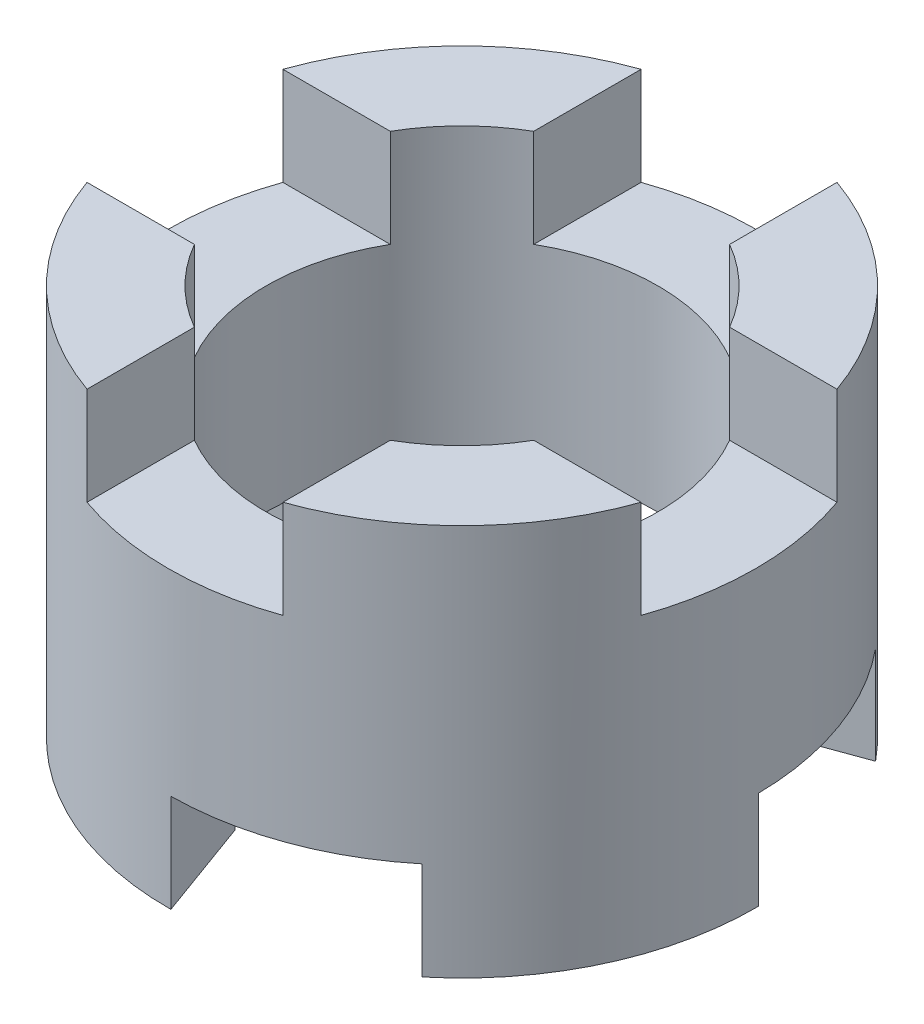
ISO-10303-21;
HEADER;
FILE_DESCRIPTION(('STEP AP214'),'2;1');
FILE_NAME('part.step','',(''),(''),'','','');
FILE_SCHEMA(('AUTOMOTIVE_DESIGN { 1 0 10303 214 1 1 1 1 }'));
ENDSEC;
DATA;
#1=APPLICATION_CONTEXT('core data for automotive mechanical design processes');
#2=APPLICATION_PROTOCOL_DEFINITION('international standard','automotive_design',2000,#1);
#3=PRODUCT_CONTEXT('',#1,'mechanical');
#4=PRODUCT('Part','Part','',(#3));
#5=PRODUCT_RELATED_PRODUCT_CATEGORY('part','',(#4));
#6=PRODUCT_DEFINITION_FORMATION('','',#4);
#7=PRODUCT_DEFINITION_CONTEXT('part definition',#1,'design');
#8=PRODUCT_DEFINITION('design','',#6,#7);
#9=PRODUCT_DEFINITION_SHAPE('','',#8);
#10=(LENGTH_UNIT() NAMED_UNIT(*) SI_UNIT(.MILLI.,.METRE.));
#11=(NAMED_UNIT(*) PLANE_ANGLE_UNIT() SI_UNIT($,.RADIAN.));
#12=(NAMED_UNIT(*) SI_UNIT($,.STERADIAN.) SOLID_ANGLE_UNIT());
#13=UNCERTAINTY_MEASURE_WITH_UNIT(LENGTH_MEASURE(1.E-05),#10,'distance_accuracy_value','');
#14=(GEOMETRIC_REPRESENTATION_CONTEXT(3) GLOBAL_UNCERTAINTY_ASSIGNED_CONTEXT((#13)) GLOBAL_UNIT_ASSIGNED_CONTEXT((#10,
#11,#12)) REPRESENTATION_CONTEXT('',''));
#15=CARTESIAN_POINT('',(0.,0.,0.));
#16=DIRECTION('',(0.,0.,1.));
#17=DIRECTION('',(1.,0.,0.));
#18=AXIS2_PLACEMENT_3D('',#15,#16,#17);
#19=CARTESIAN_POINT('',(0.,0.,0.));
#20=DIRECTION('',(0.,1.,0.));
#21=DIRECTION('',(0.,0.,1.));
#22=AXIS2_PLACEMENT_3D('',#19,#20,#21);
#23=PLANE('',#22);
#24=DIRECTION('',(-0.342020143325686,0.,-0.939692620785902));
#25=VECTOR('',#24,1.);
#26=CARTESIAN_POINT('',(16.8743368376109,0.,27.7957014885698));
#27=LINE('',#26,#25);
#28=CARTESIAN_POINT('',(12.1099051132494,0.,14.7055329093541));
#29=VERTEX_POINT('',#28);
#30=CARTESIAN_POINT('',(9.72876442761117,0.,8.16340264301887));
#31=VERTEX_POINT('',#30);
#32=EDGE_CURVE('E266',#29,#31,#27,.T.);
#33=ORIENTED_EDGE('',*,*,#32,.T.);
#34=CARTESIAN_POINT('',(0.,0.,0.));
#35=DIRECTION('',(0.,1.,0.));
#36=DIRECTION('',(0.,0.,1.));
#37=AXIS2_PLACEMENT_3D('',#34,#35,#36);
#38=CIRCLE('',#37,12.7);
#39=CARTESIAN_POINT('',(12.5070584632551,0.,2.20533185636982));
#40=VERTEX_POINT('',#39);
#41=EDGE_CURVE('E486',#31,#40,#38,.T.);
#42=ORIENTED_EDGE('',*,*,#41,.T.);
#43=DIRECTION('',(0.939692620785903,0.,-0.342020143325683));
#44=VECTOR('',#43,1.);
#45=CARTESIAN_POINT('',(-27.7957014885699,0.,16.8743368376108));
#46=LINE('',#45,#44);
#47=CARTESIAN_POINT('',(19.0491887295903,0.,-0.175808829268345));
#48=VERTEX_POINT('',#47);
#49=EDGE_CURVE('E413',#40,#48,#46,.T.);
#50=ORIENTED_EDGE('',*,*,#49,.T.);
#51=CARTESIAN_POINT('',(0.,0.,0.));
#52=DIRECTION('',(0.,1.,0.));
#53=DIRECTION('',(0.,0.,1.));
#54=AXIS2_PLACEMENT_3D('',#51,#52,#53);
#55=CIRCLE('',#54,19.05);
#56=EDGE_CURVE('E273',#29,#48,#55,.T.);
#57=ORIENTED_EDGE('',*,*,#56,.F.);
#58=EDGE_LOOP('',(#33,#42,#50,#57));
#59=FACE_BOUND('',#58,.T.);
#60=ADVANCED_FACE('F39',(#59),#23,.F.);
#61=CARTESIAN_POINT('',(0.,25.4,0.));
#62=DIRECTION('',(0.,-1.,0.));
#63=DIRECTION('',(0.,0.,-1.));
#64=AXIS2_PLACEMENT_3D('',#61,#62,#63);
#65=CYLINDRICAL_SURFACE('',#64,19.05);
#66=CARTESIAN_POINT('',(0.,19.05,0.));
#67=DIRECTION('',(0.,-1.,0.));
#68=DIRECTION('',(0.,0.,-1.));
#69=AXIS2_PLACEMENT_3D('',#66,#67,#68);
#70=CIRCLE('',#69,19.05);
#71=CARTESIAN_POINT('',(6.35000000000007,19.05,17.9605122421383));
#72=VERTEX_POINT('',#71);
#73=CARTESIAN_POINT('',(-6.34999999999993,19.05,17.9605122421383));
#74=VERTEX_POINT('',#73);
#75=EDGE_CURVE('E445',#72,#74,#70,.T.);
#76=ORIENTED_EDGE('',*,*,#75,.T.);
#77=DIRECTION('',(0.,-1.,0.));
#78=VECTOR('',#77,1.);
#79=CARTESIAN_POINT('',(-6.34999999999993,25.4,17.9605122421383));
#80=LINE('',#79,#78);
#81=CARTESIAN_POINT('',(-6.34999999999993,25.4,17.9605122421383));
#82=VERTEX_POINT('',#81);
#83=EDGE_CURVE('E452',#74,#82,#80,.F.);
#84=ORIENTED_EDGE('',*,*,#83,.T.);
#85=CARTESIAN_POINT('',(0.,25.4,0.));
#86=DIRECTION('',(0.,1.,0.));
#87=DIRECTION('',(0.,0.,1.));
#88=AXIS2_PLACEMENT_3D('',#85,#86,#87);
#89=CIRCLE('',#88,19.05);
#90=CARTESIAN_POINT('',(-17.9605122421383,25.4,6.35000000000001));
#91=VERTEX_POINT('',#90);
#92=EDGE_CURVE('E284',#91,#82,#89,.T.);
#93=ORIENTED_EDGE('',*,*,#92,.F.);
#94=DIRECTION('',(0.,-1.,0.));
#95=VECTOR('',#94,1.);
#96=CARTESIAN_POINT('',(-17.9605122421383,25.4,6.35000000000001));
#97=LINE('',#96,#95);
#98=CARTESIAN_POINT('',(-17.9605122421383,19.05,6.35000000000001));
#99=VERTEX_POINT('',#98);
#100=EDGE_CURVE('E477',#91,#99,#97,.T.);
#101=ORIENTED_EDGE('',*,*,#100,.T.);
#102=CARTESIAN_POINT('',(0.,19.05,0.));
#103=DIRECTION('',(0.,-1.,0.));
#104=DIRECTION('',(0.,0.,-1.));
#105=AXIS2_PLACEMENT_3D('',#102,#103,#104);
#106=CIRCLE('',#105,19.05);
#107=CARTESIAN_POINT('',(-17.9605122421383,19.05,-6.34999999999999));
#108=VERTEX_POINT('',#107);
#109=EDGE_CURVE('E470',#99,#108,#106,.T.);
#110=ORIENTED_EDGE('',*,*,#109,.T.);
#111=DIRECTION('',(0.,-1.,0.));
#112=VECTOR('',#111,1.);
#113=CARTESIAN_POINT('',(-17.9605122421383,25.4,-6.34999999999999));
#114=LINE('',#113,#112);
#115=CARTESIAN_POINT('',(-17.9605122421383,25.4,-6.34999999999999));
#116=VERTEX_POINT('',#115);
#117=EDGE_CURVE('E480',#108,#116,#114,.F.);
#118=ORIENTED_EDGE('',*,*,#117,.T.);
#119=CARTESIAN_POINT('',(-6.35000000000006,25.4,-17.9605122421383));
#120=VERTEX_POINT('',#119);
#121=EDGE_CURVE('E285',#120,#116,#89,.T.);
#122=ORIENTED_EDGE('',*,*,#121,.F.);
#123=DIRECTION('',(0.,-1.,0.));
#124=VECTOR('',#123,1.);
#125=CARTESIAN_POINT('',(-6.35000000000006,25.4,-17.9605122421383));
#126=LINE('',#125,#124);
#127=CARTESIAN_POINT('',(-6.35000000000006,19.05,-17.9605122421383));
#128=VERTEX_POINT('',#127);
#129=EDGE_CURVE('E455',#120,#128,#126,.T.);
#130=ORIENTED_EDGE('',*,*,#129,.T.);
#131=CARTESIAN_POINT('',(6.34999999999994,19.05,-17.9605122421383));
#132=VERTEX_POINT('',#131);
#133=EDGE_CURVE('E442',#128,#132,#70,.T.);
#134=ORIENTED_EDGE('',*,*,#133,.T.);
#135=DIRECTION('',(0.,-1.,0.));
#136=VECTOR('',#135,1.);
#137=CARTESIAN_POINT('',(6.34999999999994,25.4,-17.9605122421383));
#138=LINE('',#137,#136);
#139=CARTESIAN_POINT('',(6.34999999999994,25.4,-17.9605122421383));
#140=VERTEX_POINT('',#139);
#141=EDGE_CURVE('E446',#132,#140,#138,.F.);
#142=ORIENTED_EDGE('',*,*,#141,.T.);
#143=CARTESIAN_POINT('',(17.9605122421383,25.4,-6.35));
#144=VERTEX_POINT('',#143);
#145=EDGE_CURVE('E292',#144,#140,#89,.T.);
#146=ORIENTED_EDGE('',*,*,#145,.F.);
#147=DIRECTION('',(0.,-1.,0.));
#148=VECTOR('',#147,1.);
#149=CARTESIAN_POINT('',(17.9605122421383,25.4,-6.35));
#150=LINE('',#149,#148);
#151=CARTESIAN_POINT('',(17.9605122421383,19.05,-6.35));
#152=VERTEX_POINT('',#151);
#153=EDGE_CURVE('E483',#144,#152,#150,.T.);
#154=ORIENTED_EDGE('',*,*,#153,.T.);
#155=CARTESIAN_POINT('',(17.9605122421383,19.05,6.35));
#156=VERTEX_POINT('',#155);
#157=EDGE_CURVE('E473',#152,#156,#106,.T.);
#158=ORIENTED_EDGE('',*,*,#157,.T.);
#159=DIRECTION('',(0.,-1.,0.));
#160=VECTOR('',#159,1.);
#161=CARTESIAN_POINT('',(17.9605122421383,25.4,6.35));
#162=LINE('',#161,#160);
#163=CARTESIAN_POINT('',(17.9605122421383,25.4,6.35));
#164=VERTEX_POINT('',#163);
#165=EDGE_CURVE('E474',#156,#164,#162,.F.);
#166=ORIENTED_EDGE('',*,*,#165,.T.);
#167=CARTESIAN_POINT('',(6.35000000000007,25.4,17.9605122421383));
#168=VERTEX_POINT('',#167);
#169=EDGE_CURVE('E280',#168,#164,#89,.T.);
#170=ORIENTED_EDGE('',*,*,#169,.F.);
#171=DIRECTION('',(0.,-1.,0.));
#172=VECTOR('',#171,1.);
#173=CARTESIAN_POINT('',(6.35000000000007,25.4,17.9605122421383));
#174=LINE('',#173,#172);
#175=EDGE_CURVE('E449',#168,#72,#174,.T.);
#176=ORIENTED_EDGE('',*,*,#175,.T.);
#177=EDGE_LOOP('',(#76,#84,#93,#101,#110,#118,#122,#130,#134,#142,#146,#154,#158,#166,#170,#176));
#178=FACE_BOUND('',#177,.T.);
#179=DIRECTION('',(0.,-1.,0.));
#180=VECTOR('',#179,1.);
#181=CARTESIAN_POINT('',(12.1099051132494,25.4,14.7055329093541));
#182=LINE('',#181,#180);
#183=CARTESIAN_POINT('',(12.1099051132494,6.35,14.7055329093541));
#184=VERTEX_POINT('',#183);
#185=EDGE_CURVE('E394',#29,#184,#182,.F.);
#186=ORIENTED_EDGE('',*,*,#185,.F.);
#187=ORIENTED_EDGE('',*,*,#56,.T.);
#188=DIRECTION('',(0.,-1.,0.));
#189=VECTOR('',#188,1.);
#190=CARTESIAN_POINT('',(19.0491887295903,25.4,-0.175808829268345));
#191=LINE('',#190,#189);
#192=CARTESIAN_POINT('',(19.0491887295903,6.35,-0.175808829268345));
#193=VERTEX_POINT('',#192);
#194=EDGE_CURVE('E425',#193,#48,#191,.T.);
#195=ORIENTED_EDGE('',*,*,#194,.F.);
#196=CARTESIAN_POINT('',(0.,6.35,0.));
#197=DIRECTION('',(0.,-1.,0.));
#198=DIRECTION('',(0.,0.,-1.));
#199=AXIS2_PLACEMENT_3D('',#196,#197,#198);
#200=CIRCLE('',#199,19.05);
#201=CARTESIAN_POINT('',(14.7055329093542,6.35,-12.1099051132493));
#202=VERTEX_POINT('',#201);
#203=EDGE_CURVE('E418',#202,#193,#200,.T.);
#204=ORIENTED_EDGE('',*,*,#203,.F.);
#205=DIRECTION('',(0.,-1.,0.));
#206=VECTOR('',#205,1.);
#207=CARTESIAN_POINT('',(14.7055329093542,25.4,-12.1099051132493));
#208=LINE('',#207,#206);
#209=CARTESIAN_POINT('',(14.7055329093542,0.,-12.1099051132493));
#210=VERTEX_POINT('',#209);
#211=EDGE_CURVE('E422',#202,#210,#208,.T.);
#212=ORIENTED_EDGE('',*,*,#211,.T.);
#213=CARTESIAN_POINT('',(-0.17580882926841,0.,-19.0491887295903));
#214=VERTEX_POINT('',#213);
#215=EDGE_CURVE('E275',#210,#214,#55,.T.);
#216=ORIENTED_EDGE('',*,*,#215,.T.);
#217=DIRECTION('',(0.,-1.,0.));
#218=VECTOR('',#217,1.);
#219=CARTESIAN_POINT('',(-0.17580882926841,25.4,-19.0491887295903));
#220=LINE('',#219,#218);
#221=CARTESIAN_POINT('',(-0.17580882926841,6.35,-19.0491887295903));
#222=VERTEX_POINT('',#221);
#223=EDGE_CURVE('E396',#222,#214,#220,.T.);
#224=ORIENTED_EDGE('',*,*,#223,.F.);
#225=CARTESIAN_POINT('',(0.,6.35,0.));
#226=DIRECTION('',(0.,-1.,0.));
#227=DIRECTION('',(0.,0.,-1.));
#228=AXIS2_PLACEMENT_3D('',#225,#226,#227);
#229=CIRCLE('',#228,19.05);
#230=CARTESIAN_POINT('',(-12.1099051132494,6.35,-14.7055329093541));
#231=VERTEX_POINT('',#230);
#232=EDGE_CURVE('E398',#231,#222,#229,.T.);
#233=ORIENTED_EDGE('',*,*,#232,.F.);
#234=DIRECTION('',(0.,-1.,0.));
#235=VECTOR('',#234,1.);
#236=CARTESIAN_POINT('',(-12.1099051132494,25.4,-14.7055329093541));
#237=LINE('',#236,#235);
#238=CARTESIAN_POINT('',(-12.1099051132494,0.,-14.7055329093541));
#239=VERTEX_POINT('',#238);
#240=EDGE_CURVE('E256',#231,#239,#237,.T.);
#241=ORIENTED_EDGE('',*,*,#240,.T.);
#242=CARTESIAN_POINT('',(-19.0491887295903,0.,0.175808829268337));
#243=VERTEX_POINT('',#242);
#244=EDGE_CURVE('E272',#239,#243,#55,.T.);
#245=ORIENTED_EDGE('',*,*,#244,.T.);
#246=DIRECTION('',(0.,-1.,0.));
#247=VECTOR('',#246,1.);
#248=CARTESIAN_POINT('',(-19.0491887295903,25.4,0.175808829268338));
#249=LINE('',#248,#247);
#250=CARTESIAN_POINT('',(-19.0491887295903,6.35,0.175808829268337));
#251=VERTEX_POINT('',#250);
#252=EDGE_CURVE('E419',#243,#251,#249,.F.);
#253=ORIENTED_EDGE('',*,*,#252,.T.);
#254=CARTESIAN_POINT('',(-14.7055329093542,6.35,12.1099051132493));
#255=VERTEX_POINT('',#254);
#256=EDGE_CURVE('E416',#255,#251,#200,.T.);
#257=ORIENTED_EDGE('',*,*,#256,.F.);
#258=DIRECTION('',(0.,-1.,0.));
#259=VECTOR('',#258,1.);
#260=CARTESIAN_POINT('',(-14.7055329093542,25.4,12.1099051132493));
#261=LINE('',#260,#259);
#262=CARTESIAN_POINT('',(-14.7055329093542,0.,12.1099051132493));
#263=VERTEX_POINT('',#262);
#264=EDGE_CURVE('E271',#263,#255,#261,.F.);
#265=ORIENTED_EDGE('',*,*,#264,.F.);
#266=CARTESIAN_POINT('',(0.175808829268403,0.,19.0491887295903));
#267=VERTEX_POINT('',#266);
#268=EDGE_CURVE('E263',#263,#267,#55,.T.);
#269=ORIENTED_EDGE('',*,*,#268,.T.);
#270=DIRECTION('',(0.,-1.,0.));
#271=VECTOR('',#270,1.);
#272=CARTESIAN_POINT('',(0.175808829268402,25.4,19.0491887295903));
#273=LINE('',#272,#271);
#274=CARTESIAN_POINT('',(0.175808829268403,6.35,19.0491887295903));
#275=VERTEX_POINT('',#274);
#276=EDGE_CURVE('E248',#267,#275,#273,.F.);
#277=ORIENTED_EDGE('',*,*,#276,.T.);
#278=EDGE_CURVE('E400',#184,#275,#229,.T.);
#279=ORIENTED_EDGE('',*,*,#278,.F.);
#280=EDGE_LOOP('',(#186,#187,#195,#204,#212,#216,#224,#233,#241,#245,#253,#257,#265,#269,#277,#279));
#281=FACE_BOUND('',#280,.T.);
#282=ADVANCED_FACE('F41',(#178,#281),#65,.T.);
#283=CARTESIAN_POINT('',(0.,25.4,0.));
#284=DIRECTION('',(0.,-1.,0.));
#285=DIRECTION('',(0.,0.,-1.));
#286=AXIS2_PLACEMENT_3D('',#283,#284,#285);
#287=CYLINDRICAL_SURFACE('',#286,12.7);
#288=DIRECTION('',(0.,-1.,0.));
#289=VECTOR('',#288,1.);
#290=CARTESIAN_POINT('',(-6.34999999999995,25.4,10.9985226280624));
#291=LINE('',#290,#289);
#292=CARTESIAN_POINT('',(-6.34999999999995,19.05,10.9985226280624));
#293=VERTEX_POINT('',#292);
#294=CARTESIAN_POINT('',(-6.34999999999995,25.4,10.9985226280624));
#295=VERTEX_POINT('',#294);
#296=EDGE_CURVE('E340',#293,#295,#291,.F.);
#297=ORIENTED_EDGE('',*,*,#296,.F.);
#298=CARTESIAN_POINT('',(0.,19.05,0.));
#299=DIRECTION('',(0.,-1.,0.));
#300=DIRECTION('',(0.,0.,-1.));
#301=AXIS2_PLACEMENT_3D('',#298,#299,#300);
#302=CIRCLE('',#301,12.7);
#303=CARTESIAN_POINT('',(6.35000000000005,19.05,10.9985226280623));
#304=VERTEX_POINT('',#303);
#305=EDGE_CURVE('E332',#304,#293,#302,.T.);
#306=ORIENTED_EDGE('',*,*,#305,.F.);
#307=DIRECTION('',(0.,-1.,0.));
#308=VECTOR('',#307,1.);
#309=CARTESIAN_POINT('',(6.35000000000005,25.4,10.9985226280623));
#310=LINE('',#309,#308);
#311=CARTESIAN_POINT('',(6.35000000000005,25.4,10.9985226280623));
#312=VERTEX_POINT('',#311);
#313=EDGE_CURVE('E337',#312,#304,#310,.T.);
#314=ORIENTED_EDGE('',*,*,#313,.F.);
#315=CARTESIAN_POINT('',(0.,25.4,0.));
#316=DIRECTION('',(0.,1.,0.));
#317=DIRECTION('',(0.,0.,1.));
#318=AXIS2_PLACEMENT_3D('',#315,#316,#317);
#319=CIRCLE('',#318,12.7);
#320=CARTESIAN_POINT('',(10.9985226280624,25.4,6.35));
#321=VERTEX_POINT('',#320);
#322=EDGE_CURVE('E490',#312,#321,#319,.T.);
#323=ORIENTED_EDGE('',*,*,#322,.T.);
#324=DIRECTION('',(0.,-1.,0.));
#325=VECTOR('',#324,1.);
#326=CARTESIAN_POINT('',(10.9985226280624,25.4,6.35));
#327=LINE('',#326,#325);
#328=CARTESIAN_POINT('',(10.9985226280624,19.05,6.35));
#329=VERTEX_POINT('',#328);
#330=EDGE_CURVE('E314',#329,#321,#327,.F.);
#331=ORIENTED_EDGE('',*,*,#330,.F.);
#332=CARTESIAN_POINT('',(0.,19.05,0.));
#333=DIRECTION('',(0.,-1.,0.));
#334=DIRECTION('',(0.,0.,-1.));
#335=AXIS2_PLACEMENT_3D('',#332,#333,#334);
#336=CIRCLE('',#335,12.7);
#337=CARTESIAN_POINT('',(10.9985226280624,19.05,-6.35));
#338=VERTEX_POINT('',#337);
#339=EDGE_CURVE('E306',#338,#329,#336,.T.);
#340=ORIENTED_EDGE('',*,*,#339,.F.);
#341=DIRECTION('',(0.,-1.,0.));
#342=VECTOR('',#341,1.);
#343=CARTESIAN_POINT('',(10.9985226280624,25.4,-6.35));
#344=LINE('',#343,#342);
#345=CARTESIAN_POINT('',(10.9985226280624,25.4,-6.35));
#346=VERTEX_POINT('',#345);
#347=EDGE_CURVE('E320',#346,#338,#344,.T.);
#348=ORIENTED_EDGE('',*,*,#347,.F.);
#349=CARTESIAN_POINT('',(6.34999999999996,25.4,-10.9985226280624));
#350=VERTEX_POINT('',#349);
#351=EDGE_CURVE('E276',#346,#350,#319,.T.);
#352=ORIENTED_EDGE('',*,*,#351,.T.);
#353=DIRECTION('',(0.,-1.,0.));
#354=VECTOR('',#353,1.);
#355=CARTESIAN_POINT('',(6.34999999999996,25.4,-10.9985226280624));
#356=LINE('',#355,#354);
#357=CARTESIAN_POINT('',(6.34999999999996,19.05,-10.9985226280624));
#358=VERTEX_POINT('',#357);
#359=EDGE_CURVE('E331',#358,#350,#356,.F.);
#360=ORIENTED_EDGE('',*,*,#359,.F.);
#361=CARTESIAN_POINT('',(-6.35000000000004,19.05,-10.9985226280624));
#362=VERTEX_POINT('',#361);
#363=EDGE_CURVE('E329',#362,#358,#302,.T.);
#364=ORIENTED_EDGE('',*,*,#363,.F.);
#365=DIRECTION('',(0.,-1.,0.));
#366=VECTOR('',#365,1.);
#367=CARTESIAN_POINT('',(-6.35000000000004,25.4,-10.9985226280624));
#368=LINE('',#367,#366);
#369=CARTESIAN_POINT('',(-6.35000000000004,25.4,-10.9985226280624));
#370=VERTEX_POINT('',#369);
#371=EDGE_CURVE('E334',#370,#362,#368,.T.);
#372=ORIENTED_EDGE('',*,*,#371,.F.);
#373=CARTESIAN_POINT('',(-10.9985226280624,25.4,-6.34999999999999));
#374=VERTEX_POINT('',#373);
#375=EDGE_CURVE('E489',#370,#374,#319,.T.);
#376=ORIENTED_EDGE('',*,*,#375,.T.);
#377=DIRECTION('',(0.,-1.,0.));
#378=VECTOR('',#377,1.);
#379=CARTESIAN_POINT('',(-10.9985226280624,25.4,-6.34999999999999));
#380=LINE('',#379,#378);
#381=CARTESIAN_POINT('',(-10.9985226280624,19.05,-6.34999999999999));
#382=VERTEX_POINT('',#381);
#383=EDGE_CURVE('E312',#382,#374,#380,.F.);
#384=ORIENTED_EDGE('',*,*,#383,.F.);
#385=CARTESIAN_POINT('',(-10.9985226280624,19.05,6.35000000000001));
#386=VERTEX_POINT('',#385);
#387=EDGE_CURVE('E300',#386,#382,#336,.T.);
#388=ORIENTED_EDGE('',*,*,#387,.F.);
#389=DIRECTION('',(0.,-1.,0.));
#390=VECTOR('',#389,1.);
#391=CARTESIAN_POINT('',(-10.9985226280624,25.4,6.35000000000001));
#392=LINE('',#391,#390);
#393=CARTESIAN_POINT('',(-10.9985226280624,25.4,6.35000000000001));
#394=VERTEX_POINT('',#393);
#395=EDGE_CURVE('E305',#394,#386,#392,.T.);
#396=ORIENTED_EDGE('',*,*,#395,.F.);
#397=EDGE_CURVE('E487',#394,#295,#319,.T.);
#398=ORIENTED_EDGE('',*,*,#397,.T.);
#399=EDGE_LOOP('',(#297,#306,#314,#323,#331,#340,#348,#352,#360,#364,#372,#376,#384,#388,#396,#398));
#400=FACE_BOUND('',#399,.T.);
#401=ORIENTED_EDGE('',*,*,#41,.F.);
#402=DIRECTION('',(0.,-1.,0.));
#403=VECTOR('',#402,1.);
#404=CARTESIAN_POINT('',(9.72876442761117,25.4,8.16340264301887));
#405=LINE('',#404,#403);
#406=CARTESIAN_POINT('',(9.72876442761117,6.35,8.16340264301887));
#407=VERTEX_POINT('',#406);
#408=EDGE_CURVE('E390',#31,#407,#405,.F.);
#409=ORIENTED_EDGE('',*,*,#408,.T.);
#410=CARTESIAN_POINT('',(0.,6.35,0.));
#411=DIRECTION('',(0.,-1.,0.));
#412=DIRECTION('',(0.,0.,-1.));
#413=AXIS2_PLACEMENT_3D('',#410,#411,#412);
#414=CIRCLE('',#413,12.7);
#415=CARTESIAN_POINT('',(-2.20533185636979,6.35,12.5070584632551));
#416=VERTEX_POINT('',#415);
#417=EDGE_CURVE('E12',#407,#416,#414,.T.);
#418=ORIENTED_EDGE('',*,*,#417,.T.);
#419=DIRECTION('',(0.,-1.,0.));
#420=VECTOR('',#419,1.);
#421=CARTESIAN_POINT('',(-2.20533185636979,25.4,12.5070584632551));
#422=LINE('',#421,#420);
#423=CARTESIAN_POINT('',(-2.20533185636979,0.,12.5070584632551));
#424=VERTEX_POINT('',#423);
#425=EDGE_CURVE('E386',#424,#416,#422,.F.);
#426=ORIENTED_EDGE('',*,*,#425,.F.);
#427=CARTESIAN_POINT('',(-8.16340264301891,0.,9.72876442761114));
#428=VERTEX_POINT('',#427);
#429=EDGE_CURVE('E265',#428,#424,#38,.T.);
#430=ORIENTED_EDGE('',*,*,#429,.F.);
#431=DIRECTION('',(0.,-1.,0.));
#432=VECTOR('',#431,1.);
#433=CARTESIAN_POINT('',(-8.16340264301891,25.4,9.72876442761114));
#434=LINE('',#433,#432);
#435=CARTESIAN_POINT('',(-8.16340264301891,6.35,9.72876442761114));
#436=VERTEX_POINT('',#435);
#437=EDGE_CURVE('E349',#428,#436,#434,.F.);
#438=ORIENTED_EDGE('',*,*,#437,.T.);
#439=CARTESIAN_POINT('',(0.,6.35,0.));
#440=DIRECTION('',(0.,-1.,0.));
#441=DIRECTION('',(0.,0.,-1.));
#442=AXIS2_PLACEMENT_3D('',#439,#440,#441);
#443=CIRCLE('',#442,12.7);
#444=CARTESIAN_POINT('',(-12.5070584632551,6.35,-2.20533185636983));
#445=VERTEX_POINT('',#444);
#446=EDGE_CURVE('E342',#436,#445,#443,.T.);
#447=ORIENTED_EDGE('',*,*,#446,.T.);
#448=DIRECTION('',(0.,-1.,0.));
#449=VECTOR('',#448,1.);
#450=CARTESIAN_POINT('',(-12.5070584632551,25.4,-2.20533185636983));
#451=LINE('',#450,#449);
#452=CARTESIAN_POINT('',(-12.5070584632551,0.,-2.20533185636983));
#453=VERTEX_POINT('',#452);
#454=EDGE_CURVE('E345',#453,#445,#451,.F.);
#455=ORIENTED_EDGE('',*,*,#454,.F.);
#456=CARTESIAN_POINT('',(-9.72876442761117,0.,-8.16340264301887));
#457=VERTEX_POINT('',#456);
#458=EDGE_CURVE('E491',#457,#453,#38,.T.);
#459=ORIENTED_EDGE('',*,*,#458,.F.);
#460=DIRECTION('',(0.,-1.,0.));
#461=VECTOR('',#460,1.);
#462=CARTESIAN_POINT('',(-9.72876442761117,25.4,-8.16340264301887));
#463=LINE('',#462,#461);
#464=CARTESIAN_POINT('',(-9.72876442761117,6.35,-8.16340264301887));
#465=VERTEX_POINT('',#464);
#466=EDGE_CURVE('E62',#465,#457,#463,.T.);
#467=ORIENTED_EDGE('',*,*,#466,.F.);
#468=CARTESIAN_POINT('',(2.20533185636978,6.35,-12.5070584632551));
#469=VERTEX_POINT('',#468);
#470=EDGE_CURVE('E43',#465,#469,#414,.T.);
#471=ORIENTED_EDGE('',*,*,#470,.T.);
#472=DIRECTION('',(0.,-1.,0.));
#473=VECTOR('',#472,1.);
#474=CARTESIAN_POINT('',(2.20533185636978,25.4,-12.5070584632551));
#475=LINE('',#474,#473);
#476=CARTESIAN_POINT('',(2.20533185636978,0.,-12.5070584632551));
#477=VERTEX_POINT('',#476);
#478=EDGE_CURVE('E367',#469,#477,#475,.T.);
#479=ORIENTED_EDGE('',*,*,#478,.T.);
#480=CARTESIAN_POINT('',(8.1634026430189,0.,-9.72876442761114));
#481=VERTEX_POINT('',#480);
#482=EDGE_CURVE('E492',#481,#477,#38,.T.);
#483=ORIENTED_EDGE('',*,*,#482,.F.);
#484=DIRECTION('',(0.,-1.,0.));
#485=VECTOR('',#484,1.);
#486=CARTESIAN_POINT('',(8.1634026430189,25.4,-9.72876442761114));
#487=LINE('',#486,#485);
#488=CARTESIAN_POINT('',(8.1634026430189,6.35,-9.72876442761114));
#489=VERTEX_POINT('',#488);
#490=EDGE_CURVE('E352',#489,#481,#487,.T.);
#491=ORIENTED_EDGE('',*,*,#490,.F.);
#492=CARTESIAN_POINT('',(12.5070584632551,6.35,2.20533185636982));
#493=VERTEX_POINT('',#492);
#494=EDGE_CURVE('E346',#489,#493,#443,.T.);
#495=ORIENTED_EDGE('',*,*,#494,.T.);
#496=DIRECTION('',(0.,-1.,0.));
#497=VECTOR('',#496,1.);
#498=CARTESIAN_POINT('',(12.5070584632551,25.4,2.20533185636982));
#499=LINE('',#498,#497);
#500=EDGE_CURVE('E354',#493,#40,#499,.T.);
#501=ORIENTED_EDGE('',*,*,#500,.T.);
#502=EDGE_LOOP('',(#401,#409,#418,#426,#430,#438,#447,#455,#459,#467,#471,#479,#483,#491,#495,#501));
#503=FACE_BOUND('',#502,.T.);
#504=ADVANCED_FACE('F365',(#400,#503),#287,.F.);
#505=DIRECTION('',(0.342020143325686,0.,0.939692620785902));
#506=VECTOR('',#505,1.);
#507=CARTESIAN_POINT('',(5.96704814199048,0.,-2.17182791011811));
#508=LINE('',#507,#506);
#509=EDGE_CURVE('E358',#214,#477,#508,.T.);
#510=ORIENTED_EDGE('',*,*,#509,.F.);
#511=ORIENTED_EDGE('',*,*,#215,.F.);
#512=DIRECTION('',(0.939692620785903,0.,-0.342020143325683));
#513=VECTOR('',#512,1.);
#514=CARTESIAN_POINT('',(-32.1393573088061,0.,4.94024055362979));
#515=LINE('',#514,#513);
#516=EDGE_CURVE('E410',#481,#210,#515,.T.);
#517=ORIENTED_EDGE('',*,*,#516,.F.);
#518=ORIENTED_EDGE('',*,*,#482,.T.);
#519=EDGE_LOOP('',(#510,#511,#517,#518));
#520=FACE_BOUND('',#519,.T.);
#521=ADVANCED_FACE('F558',(#520),#23,.F.);
#522=ORIENTED_EDGE('',*,*,#429,.T.);
#523=DIRECTION('',(-0.342020143325686,0.,-0.939692620785902));
#524=VECTOR('',#523,1.);
#525=CARTESIAN_POINT('',(4.94024055362991,0.,32.1393573088061));
#526=LINE('',#525,#524);
#527=EDGE_CURVE('E251',#267,#424,#526,.T.);
#528=ORIENTED_EDGE('',*,*,#527,.F.);
#529=ORIENTED_EDGE('',*,*,#268,.F.);
#530=EDGE_CURVE('E405',#263,#428,#46,.T.);
#531=ORIENTED_EDGE('',*,*,#530,.T.);
#532=EDGE_LOOP('',(#522,#528,#529,#531));
#533=FACE_BOUND('',#532,.T.);
#534=ADVANCED_FACE('F261',(#533),#23,.F.);
#535=CARTESIAN_POINT('',(0.,25.4,0.));
#536=DIRECTION('',(0.,1.,0.));
#537=DIRECTION('',(0.,0.,1.));
#538=AXIS2_PLACEMENT_3D('',#535,#536,#537);
#539=PLANE('',#538);
#540=DIRECTION('',(0.,0.,1.));
#541=VECTOR('',#540,1.);
#542=CARTESIAN_POINT('',(-6.35000000000013,25.4,-38.0999999999997));
#543=LINE('',#542,#541);
#544=EDGE_CURVE('E433',#120,#370,#543,.T.);
#545=ORIENTED_EDGE('',*,*,#544,.F.);
#546=ORIENTED_EDGE('',*,*,#121,.T.);
#547=DIRECTION('',(-1.,0.,0.));
#548=VECTOR('',#547,1.);
#549=CARTESIAN_POINT('',(38.0999999999997,25.4,-6.35));
#550=LINE('',#549,#548);
#551=EDGE_CURVE('E468',#374,#116,#550,.T.);
#552=ORIENTED_EDGE('',*,*,#551,.F.);
#553=ORIENTED_EDGE('',*,*,#375,.F.);
#554=EDGE_LOOP('',(#545,#546,#552,#553));
#555=FACE_BOUND('',#554,.T.);
#556=ADVANCED_FACE('F518',(#555),#539,.T.);
#557=EDGE_CURVE('E440',#295,#82,#543,.T.);
#558=ORIENTED_EDGE('',*,*,#557,.F.);
#559=ORIENTED_EDGE('',*,*,#397,.F.);
#560=DIRECTION('',(1.,0.,0.));
#561=VECTOR('',#560,1.);
#562=CARTESIAN_POINT('',(38.0999999999997,25.4,6.35));
#563=LINE('',#562,#561);
#564=EDGE_CURVE('E467',#91,#394,#563,.T.);
#565=ORIENTED_EDGE('',*,*,#564,.F.);
#566=ORIENTED_EDGE('',*,*,#92,.T.);
#567=EDGE_LOOP('',(#558,#559,#565,#566));
#568=FACE_BOUND('',#567,.T.);
#569=ADVANCED_FACE('F530',(#568),#539,.T.);
#570=DIRECTION('',(0.,0.,-1.));
#571=VECTOR('',#570,1.);
#572=CARTESIAN_POINT('',(6.34999999999987,25.4,-38.0999999999998));
#573=LINE('',#572,#571);
#574=EDGE_CURVE('E428',#350,#140,#573,.T.);
#575=ORIENTED_EDGE('',*,*,#574,.F.);
#576=ORIENTED_EDGE('',*,*,#351,.F.);
#577=EDGE_CURVE('E462',#144,#346,#550,.T.);
#578=ORIENTED_EDGE('',*,*,#577,.F.);
#579=ORIENTED_EDGE('',*,*,#145,.T.);
#580=EDGE_LOOP('',(#575,#576,#578,#579));
#581=FACE_BOUND('',#580,.T.);
#582=ADVANCED_FACE('F507',(#581),#539,.T.);
#583=EDGE_CURVE('E439',#168,#312,#573,.T.);
#584=ORIENTED_EDGE('',*,*,#583,.F.);
#585=ORIENTED_EDGE('',*,*,#169,.T.);
#586=EDGE_CURVE('E458',#321,#164,#563,.T.);
#587=ORIENTED_EDGE('',*,*,#586,.F.);
#588=ORIENTED_EDGE('',*,*,#322,.F.);
#589=EDGE_LOOP('',(#584,#585,#587,#588));
#590=FACE_BOUND('',#589,.T.);
#591=ADVANCED_FACE('F540',(#590),#539,.T.);
#592=ORIENTED_EDGE('',*,*,#244,.F.);
#593=DIRECTION('',(0.342020143325686,0.,0.939692620785902));
#594=VECTOR('',#593,1.);
#595=CARTESIAN_POINT('',(-5.96704814199048,0.,2.17182791011811));
#596=LINE('',#595,#594);
#597=EDGE_CURVE('E357',#239,#457,#596,.T.);
#598=ORIENTED_EDGE('',*,*,#597,.T.);
#599=ORIENTED_EDGE('',*,*,#458,.T.);
#600=EDGE_CURVE('E412',#243,#453,#515,.T.);
#601=ORIENTED_EDGE('',*,*,#600,.F.);
#602=EDGE_LOOP('',(#592,#598,#599,#601));
#603=FACE_BOUND('',#602,.T.);
#604=ADVANCED_FACE('F559',(#603),#23,.F.);
#605=CARTESIAN_POINT('',(0.,19.05,0.));
#606=DIRECTION('',(0.,-1.,0.));
#607=DIRECTION('',(0.,0.,-1.));
#608=AXIS2_PLACEMENT_3D('',#605,#606,#607);
#609=PLANE('',#608);
#610=DIRECTION('',(1.,0.,0.));
#611=VECTOR('',#610,1.);
#612=CARTESIAN_POINT('',(38.0999999999997,19.05,6.35));
#613=LINE('',#612,#611);
#614=EDGE_CURVE('E461',#99,#386,#613,.T.);
#615=ORIENTED_EDGE('',*,*,#614,.T.);
#616=ORIENTED_EDGE('',*,*,#387,.T.);
#617=DIRECTION('',(-1.,0.,0.));
#618=VECTOR('',#617,1.);
#619=CARTESIAN_POINT('',(38.0999999999997,19.05,-6.35));
#620=LINE('',#619,#618);
#621=EDGE_CURVE('E463',#382,#108,#620,.T.);
#622=ORIENTED_EDGE('',*,*,#621,.T.);
#623=ORIENTED_EDGE('',*,*,#109,.F.);
#624=EDGE_LOOP('',(#615,#616,#622,#623));
#625=FACE_BOUND('',#624,.T.);
#626=ADVANCED_FACE('F522',(#625),#609,.F.);
#627=CARTESIAN_POINT('',(38.0999999999997,19.05,6.35));
#628=DIRECTION('',(0.,0.,1.));
#629=DIRECTION('',(1.,0.,0.));
#630=AXIS2_PLACEMENT_3D('',#627,#628,#629);
#631=PLANE('',#630);
#632=ORIENTED_EDGE('',*,*,#564,.T.);
#633=ORIENTED_EDGE('',*,*,#395,.T.);
#634=ORIENTED_EDGE('',*,*,#614,.F.);
#635=ORIENTED_EDGE('',*,*,#100,.F.);
#636=EDGE_LOOP('',(#632,#633,#634,#635));
#637=FACE_BOUND('',#636,.T.);
#638=ADVANCED_FACE('F524',(#637),#631,.F.);
#639=CARTESIAN_POINT('',(38.0999999999997,19.05,-6.35));
#640=DIRECTION('',(0.,0.,-1.));
#641=DIRECTION('',(-1.,0.,0.));
#642=AXIS2_PLACEMENT_3D('',#639,#640,#641);
#643=PLANE('',#642);
#644=ORIENTED_EDGE('',*,*,#621,.F.);
#645=ORIENTED_EDGE('',*,*,#383,.T.);
#646=ORIENTED_EDGE('',*,*,#551,.T.);
#647=ORIENTED_EDGE('',*,*,#117,.F.);
#648=EDGE_LOOP('',(#644,#645,#646,#647));
#649=FACE_BOUND('',#648,.T.);
#650=ADVANCED_FACE('F519',(#649),#643,.F.);
#651=ORIENTED_EDGE('',*,*,#577,.T.);
#652=ORIENTED_EDGE('',*,*,#347,.T.);
#653=EDGE_CURVE('E465',#152,#338,#620,.T.);
#654=ORIENTED_EDGE('',*,*,#653,.F.);
#655=ORIENTED_EDGE('',*,*,#153,.F.);
#656=EDGE_LOOP('',(#651,#652,#654,#655));
#657=FACE_BOUND('',#656,.T.);
#658=ADVANCED_FACE('F547',(#657),#643,.F.);
#659=EDGE_CURVE('E459',#329,#156,#613,.T.);
#660=ORIENTED_EDGE('',*,*,#659,.F.);
#661=ORIENTED_EDGE('',*,*,#330,.T.);
#662=ORIENTED_EDGE('',*,*,#586,.T.);
#663=ORIENTED_EDGE('',*,*,#165,.F.);
#664=EDGE_LOOP('',(#660,#661,#662,#663));
#665=FACE_BOUND('',#664,.T.);
#666=ADVANCED_FACE('F542',(#665),#631,.F.);
#667=ORIENTED_EDGE('',*,*,#653,.T.);
#668=ORIENTED_EDGE('',*,*,#339,.T.);
#669=ORIENTED_EDGE('',*,*,#659,.T.);
#670=ORIENTED_EDGE('',*,*,#157,.F.);
#671=EDGE_LOOP('',(#667,#668,#669,#670));
#672=FACE_BOUND('',#671,.T.);
#673=ADVANCED_FACE('F545',(#672),#609,.F.);
#674=CARTESIAN_POINT('',(0.,19.05,0.));
#675=DIRECTION('',(0.,-1.,0.));
#676=DIRECTION('',(-1.,0.,0.));
#677=AXIS2_PLACEMENT_3D('',#674,#675,#676);
#678=PLANE('',#677);
#679=DIRECTION('',(0.,0.,1.));
#680=VECTOR('',#679,1.);
#681=CARTESIAN_POINT('',(-6.35000000000013,19.05,-38.0999999999997));
#682=LINE('',#681,#680);
#683=EDGE_CURVE('E437',#128,#362,#682,.T.);
#684=ORIENTED_EDGE('',*,*,#683,.T.);
#685=ORIENTED_EDGE('',*,*,#363,.T.);
#686=DIRECTION('',(0.,0.,-1.));
#687=VECTOR('',#686,1.);
#688=CARTESIAN_POINT('',(6.34999999999987,19.05,-38.0999999999998));
#689=LINE('',#688,#687);
#690=EDGE_CURVE('E429',#358,#132,#689,.T.);
#691=ORIENTED_EDGE('',*,*,#690,.T.);
#692=ORIENTED_EDGE('',*,*,#133,.F.);
#693=EDGE_LOOP('',(#684,#685,#691,#692));
#694=FACE_BOUND('',#693,.T.);
#695=ADVANCED_FACE('F515',(#694),#678,.F.);
#696=CARTESIAN_POINT('',(6.34999999999987,19.05,-38.0999999999998));
#697=DIRECTION('',(1.,0.,0.));
#698=DIRECTION('',(0.,0.,-1.));
#699=AXIS2_PLACEMENT_3D('',#696,#697,#698);
#700=PLANE('',#699);
#701=ORIENTED_EDGE('',*,*,#690,.F.);
#702=ORIENTED_EDGE('',*,*,#359,.T.);
#703=ORIENTED_EDGE('',*,*,#574,.T.);
#704=ORIENTED_EDGE('',*,*,#141,.F.);
#705=EDGE_LOOP('',(#701,#702,#703,#704));
#706=FACE_BOUND('',#705,.T.);
#707=ADVANCED_FACE('F510',(#706),#700,.F.);
#708=CARTESIAN_POINT('',(-6.35000000000013,19.05,-38.0999999999997));
#709=DIRECTION('',(-1.,0.,0.));
#710=DIRECTION('',(0.,0.,1.));
#711=AXIS2_PLACEMENT_3D('',#708,#709,#710);
#712=PLANE('',#711);
#713=ORIENTED_EDGE('',*,*,#544,.T.);
#714=ORIENTED_EDGE('',*,*,#371,.T.);
#715=ORIENTED_EDGE('',*,*,#683,.F.);
#716=ORIENTED_EDGE('',*,*,#129,.F.);
#717=EDGE_LOOP('',(#713,#714,#715,#716));
#718=FACE_BOUND('',#717,.T.);
#719=ADVANCED_FACE('F517',(#718),#712,.F.);
#720=EDGE_CURVE('E434',#293,#74,#682,.T.);
#721=ORIENTED_EDGE('',*,*,#720,.F.);
#722=ORIENTED_EDGE('',*,*,#296,.T.);
#723=ORIENTED_EDGE('',*,*,#557,.T.);
#724=ORIENTED_EDGE('',*,*,#83,.F.);
#725=EDGE_LOOP('',(#721,#722,#723,#724));
#726=FACE_BOUND('',#725,.T.);
#727=ADVANCED_FACE('F533',(#726),#712,.F.);
#728=ORIENTED_EDGE('',*,*,#583,.T.);
#729=ORIENTED_EDGE('',*,*,#313,.T.);
#730=EDGE_CURVE('E432',#72,#304,#689,.T.);
#731=ORIENTED_EDGE('',*,*,#730,.F.);
#732=ORIENTED_EDGE('',*,*,#175,.F.);
#733=EDGE_LOOP('',(#728,#729,#731,#732));
#734=FACE_BOUND('',#733,.T.);
#735=ADVANCED_FACE('F538',(#734),#700,.F.);
#736=ORIENTED_EDGE('',*,*,#730,.T.);
#737=ORIENTED_EDGE('',*,*,#305,.T.);
#738=ORIENTED_EDGE('',*,*,#720,.T.);
#739=ORIENTED_EDGE('',*,*,#75,.F.);
#740=EDGE_LOOP('',(#736,#737,#738,#739));
#741=FACE_BOUND('',#740,.T.);
#742=ADVANCED_FACE('F536',(#741),#678,.F.);
#743=CARTESIAN_POINT('',(0.,6.35,0.));
#744=DIRECTION('',(0.,-1.,0.));
#745=DIRECTION('',(0.,0.,-1.));
#746=AXIS2_PLACEMENT_3D('',#743,#744,#745);
#747=PLANE('',#746);
#748=ORIENTED_EDGE('',*,*,#256,.T.);
#749=DIRECTION('',(0.939692620785903,0.,-0.342020143325683));
#750=VECTOR('',#749,1.);
#751=CARTESIAN_POINT('',(-32.1393573088061,6.35,4.94024055362979));
#752=LINE('',#751,#750);
#753=EDGE_CURVE('E404',#251,#445,#752,.T.);
#754=ORIENTED_EDGE('',*,*,#753,.T.);
#755=ORIENTED_EDGE('',*,*,#446,.F.);
#756=DIRECTION('',(0.939692620785903,0.,-0.342020143325683));
#757=VECTOR('',#756,1.);
#758=CARTESIAN_POINT('',(-27.7957014885699,6.35,16.8743368376108));
#759=LINE('',#758,#757);
#760=EDGE_CURVE('E409',#255,#436,#759,.T.);
#761=ORIENTED_EDGE('',*,*,#760,.F.);
#762=EDGE_LOOP('',(#748,#754,#755,#761));
#763=FACE_BOUND('',#762,.T.);
#764=ADVANCED_FACE('F679',(#763),#747,.T.);
#765=CARTESIAN_POINT('',(-32.1393573088061,6.35,4.94024055362979));
#766=DIRECTION('',(-0.342020143325683,0.,-0.939692620785903));
#767=DIRECTION('',(-0.939692620785903,0.,0.342020143325683));
#768=AXIS2_PLACEMENT_3D('',#765,#766,#767);
#769=PLANE('',#768);
#770=ORIENTED_EDGE('',*,*,#600,.T.);
#771=ORIENTED_EDGE('',*,*,#454,.T.);
#772=ORIENTED_EDGE('',*,*,#753,.F.);
#773=ORIENTED_EDGE('',*,*,#252,.F.);
#774=EDGE_LOOP('',(#770,#771,#772,#773));
#775=FACE_BOUND('',#774,.T.);
#776=ADVANCED_FACE('F688',(#775),#769,.F.);
#777=CARTESIAN_POINT('',(-27.7957014885699,6.35,16.8743368376108));
#778=DIRECTION('',(-0.342020143325683,0.,-0.939692620785903));
#779=DIRECTION('',(-0.939692620785903,0.,0.342020143325683));
#780=AXIS2_PLACEMENT_3D('',#777,#778,#779);
#781=PLANE('',#780);
#782=ORIENTED_EDGE('',*,*,#264,.T.);
#783=ORIENTED_EDGE('',*,*,#760,.T.);
#784=ORIENTED_EDGE('',*,*,#437,.F.);
#785=ORIENTED_EDGE('',*,*,#530,.F.);
#786=EDGE_LOOP('',(#782,#783,#784,#785));
#787=FACE_BOUND('',#786,.T.);
#788=ADVANCED_FACE('F699',(#787),#781,.T.);
#789=ORIENTED_EDGE('',*,*,#194,.T.);
#790=ORIENTED_EDGE('',*,*,#49,.F.);
#791=ORIENTED_EDGE('',*,*,#500,.F.);
#792=EDGE_CURVE('E406',#493,#193,#759,.T.);
#793=ORIENTED_EDGE('',*,*,#792,.T.);
#794=EDGE_LOOP('',(#789,#790,#791,#793));
#795=FACE_BOUND('',#794,.T.);
#796=ADVANCED_FACE('F710',(#795),#781,.T.);
#797=EDGE_CURVE('E401',#489,#202,#752,.T.);
#798=ORIENTED_EDGE('',*,*,#797,.F.);
#799=ORIENTED_EDGE('',*,*,#490,.T.);
#800=ORIENTED_EDGE('',*,*,#516,.T.);
#801=ORIENTED_EDGE('',*,*,#211,.F.);
#802=EDGE_LOOP('',(#798,#799,#800,#801));
#803=FACE_BOUND('',#802,.T.);
#804=ADVANCED_FACE('F702',(#803),#769,.F.);
#805=ORIENTED_EDGE('',*,*,#203,.T.);
#806=ORIENTED_EDGE('',*,*,#792,.F.);
#807=ORIENTED_EDGE('',*,*,#494,.F.);
#808=ORIENTED_EDGE('',*,*,#797,.T.);
#809=EDGE_LOOP('',(#805,#806,#807,#808));
#810=FACE_BOUND('',#809,.T.);
#811=ADVANCED_FACE('F691',(#810),#747,.T.);
#812=CARTESIAN_POINT('',(16.8743368376109,6.35,27.7957014885698));
#813=DIRECTION('',(-0.939692620785902,0.,0.342020143325686));
#814=DIRECTION('',(0.342020143325686,0.,0.939692620785902));
#815=AXIS2_PLACEMENT_3D('',#812,#813,#814);
#816=PLANE('',#815);
#817=ORIENTED_EDGE('',*,*,#223,.T.);
#818=ORIENTED_EDGE('',*,*,#509,.T.);
#819=ORIENTED_EDGE('',*,*,#478,.F.);
#820=DIRECTION('',(-0.342020143325686,0.,-0.939692620785902));
#821=VECTOR('',#820,1.);
#822=CARTESIAN_POINT('',(16.8743368376109,6.35,27.7957014885698));
#823=LINE('',#822,#821);
#824=EDGE_CURVE('E377',#469,#222,#823,.T.);
#825=ORIENTED_EDGE('',*,*,#824,.T.);
#826=EDGE_LOOP('',(#817,#818,#819,#825));
#827=FACE_BOUND('',#826,.T.);
#828=ADVANCED_FACE('F735',(#827),#816,.T.);
#829=CARTESIAN_POINT('',(4.94024055362991,6.35,32.1393573088061));
#830=DIRECTION('',(-0.939692620785902,0.,0.342020143325686));
#831=DIRECTION('',(0.342020143325686,0.,0.939692620785902));
#832=AXIS2_PLACEMENT_3D('',#829,#830,#831);
#833=PLANE('',#832);
#834=DIRECTION('',(-0.342020143325686,0.,-0.939692620785902));
#835=VECTOR('',#834,1.);
#836=CARTESIAN_POINT('',(4.94024055362991,6.35,32.1393573088061));
#837=LINE('',#836,#835);
#838=EDGE_CURVE('E374',#465,#231,#837,.T.);
#839=ORIENTED_EDGE('',*,*,#838,.F.);
#840=ORIENTED_EDGE('',*,*,#466,.T.);
#841=ORIENTED_EDGE('',*,*,#597,.F.);
#842=ORIENTED_EDGE('',*,*,#240,.F.);
#843=EDGE_LOOP('',(#839,#840,#841,#842));
#844=FACE_BOUND('',#843,.T.);
#845=ADVANCED_FACE('F378',(#844),#833,.F.);
#846=CARTESIAN_POINT('',(0.,6.35,0.));
#847=DIRECTION('',(0.,-1.,0.));
#848=DIRECTION('',(-1.,0.,0.));
#849=AXIS2_PLACEMENT_3D('',#846,#847,#848);
#850=PLANE('',#849);
#851=ORIENTED_EDGE('',*,*,#232,.T.);
#852=ORIENTED_EDGE('',*,*,#824,.F.);
#853=ORIENTED_EDGE('',*,*,#470,.F.);
#854=ORIENTED_EDGE('',*,*,#838,.T.);
#855=EDGE_LOOP('',(#851,#852,#853,#854));
#856=FACE_BOUND('',#855,.T.);
#857=ADVANCED_FACE('F373',(#856),#850,.T.);
#858=ORIENTED_EDGE('',*,*,#278,.T.);
#859=EDGE_CURVE('E54',#275,#416,#837,.T.);
#860=ORIENTED_EDGE('',*,*,#859,.T.);
#861=ORIENTED_EDGE('',*,*,#417,.F.);
#862=EDGE_CURVE('E384',#184,#407,#823,.T.);
#863=ORIENTED_EDGE('',*,*,#862,.F.);
#864=EDGE_LOOP('',(#858,#860,#861,#863));
#865=FACE_BOUND('',#864,.T.);
#866=ADVANCED_FACE('F790',(#865),#850,.T.);
#867=ORIENTED_EDGE('',*,*,#185,.T.);
#868=ORIENTED_EDGE('',*,*,#862,.T.);
#869=ORIENTED_EDGE('',*,*,#408,.F.);
#870=ORIENTED_EDGE('',*,*,#32,.F.);
#871=EDGE_LOOP('',(#867,#868,#869,#870));
#872=FACE_BOUND('',#871,.T.);
#873=ADVANCED_FACE('F774',(#872),#816,.T.);
#874=ORIENTED_EDGE('',*,*,#527,.T.);
#875=ORIENTED_EDGE('',*,*,#425,.T.);
#876=ORIENTED_EDGE('',*,*,#859,.F.);
#877=ORIENTED_EDGE('',*,*,#276,.F.);
#878=EDGE_LOOP('',(#874,#875,#876,#877));
#879=FACE_BOUND('',#878,.T.);
#880=ADVANCED_FACE('F250',(#879),#833,.F.);
#881=CLOSED_SHELL('',(#60,#282,#504,#521,#534,#556,#569,#582,#591,#604,#626,#638,#650,#658,#666,
#673,#695,#707,#719,#727,#735,#742,#764,#776,#788,#796,#804,#811,#828,#845,#857,#866,#873,#880));
#882=MANIFOLD_SOLID_BREP('B2',#881);
#883=ADVANCED_BREP_SHAPE_REPRESENTATION('',(#18,#882),#14);
#884=SHAPE_DEFINITION_REPRESENTATION(#9,#883);
ENDSEC;
END-ISO-10303-21;
